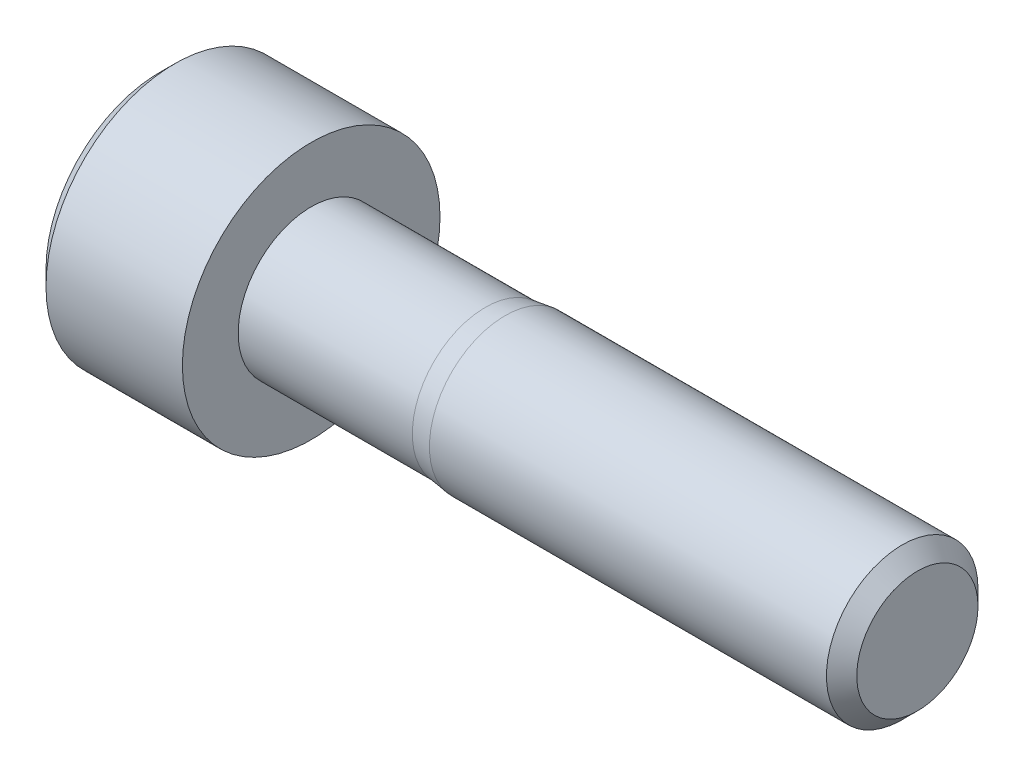
ISO-10303-21;
HEADER;
FILE_DESCRIPTION(('STEP AP214'),'2;1');
FILE_NAME('part.step','',(''),(''),'','','');
FILE_SCHEMA(('AUTOMOTIVE_DESIGN { 1 0 10303 214 1 1 1 1 }'));
ENDSEC;
DATA;
#1=APPLICATION_CONTEXT('core data for automotive mechanical design processes');
#2=APPLICATION_PROTOCOL_DEFINITION('international standard','automotive_design',2000,#1);
#3=PRODUCT_CONTEXT('',#1,'mechanical');
#4=PRODUCT('Part','Part','',(#3));
#5=PRODUCT_RELATED_PRODUCT_CATEGORY('part','',(#4));
#6=PRODUCT_DEFINITION_FORMATION('','',#4);
#7=PRODUCT_DEFINITION_CONTEXT('part definition',#1,'design');
#8=PRODUCT_DEFINITION('design','',#6,#7);
#9=PRODUCT_DEFINITION_SHAPE('','',#8);
#10=(LENGTH_UNIT() NAMED_UNIT(*) SI_UNIT(.MILLI.,.METRE.));
#11=(NAMED_UNIT(*) PLANE_ANGLE_UNIT() SI_UNIT($,.RADIAN.));
#12=(NAMED_UNIT(*) SI_UNIT($,.STERADIAN.) SOLID_ANGLE_UNIT());
#13=UNCERTAINTY_MEASURE_WITH_UNIT(LENGTH_MEASURE(1.E-05),#10,'distance_accuracy_value','');
#14=(GEOMETRIC_REPRESENTATION_CONTEXT(3) GLOBAL_UNCERTAINTY_ASSIGNED_CONTEXT((#13)) GLOBAL_UNIT_ASSIGNED_CONTEXT((#10,
#11,#12)) REPRESENTATION_CONTEXT('',''));
#15=CARTESIAN_POINT('',(0.,0.,0.));
#16=DIRECTION('',(0.,0.,1.));
#17=DIRECTION('',(1.,0.,0.));
#18=AXIS2_PLACEMENT_3D('',#15,#16,#17);
#19=CARTESIAN_POINT('',(-2.5,0.,0.));
#20=DIRECTION('',(-1.,0.,0.));
#21=DIRECTION('',(0.,0.,1.));
#22=AXIS2_PLACEMENT_3D('',#19,#20,#21);
#23=PLANE('',#22);
#24=DIRECTION('',(0.,-1.,0.));
#25=VECTOR('',#24,1.);
#26=CARTESIAN_POINT('',(-2.5,1.1547005383793,-2.));
#27=LINE('',#26,#25);
#28=CARTESIAN_POINT('',(-2.5,1.1547005383793,-2.));
#29=VERTEX_POINT('',#28);
#30=CARTESIAN_POINT('',(-2.5000000000068,0.,-2.));
#31=VERTEX_POINT('',#30);
#32=EDGE_CURVE('E484',#29,#31,#27,.T.);
#33=ORIENTED_EDGE('',*,*,#32,.T.);
#34=CARTESIAN_POINT('',(-2.5000000000068,0.,0.));
#35=DIRECTION('',(1.,0.,0.));
#36=DIRECTION('',(0.,0.,-1.));
#37=AXIS2_PLACEMENT_3D('',#34,#35,#36);
#38=CIRCLE('',#37,1.99999999999607);
#39=CARTESIAN_POINT('',(-2.5000000000068,1.7320508075655,-0.999999999998002));
#40=VERTEX_POINT('',#39);
#41=EDGE_CURVE('E75',#31,#40,#38,.T.);
#42=ORIENTED_EDGE('',*,*,#41,.T.);
#43=DIRECTION('',(0.,-0.499999999999983,-0.866025403784448));
#44=VECTOR('',#43,1.);
#45=CARTESIAN_POINT('',(-2.5,2.3094010767585,0.));
#46=LINE('',#45,#44);
#47=EDGE_CURVE('E402',#40,#29,#46,.T.);
#48=ORIENTED_EDGE('',*,*,#47,.T.);
#49=EDGE_LOOP('',(#33,#42,#48));
#50=FACE_BOUND('',#49,.T.);
#51=ADVANCED_FACE('F56',(#50),#23,.T.);
#52=CARTESIAN_POINT('',(-2.5,2.3094010767585,0.));
#53=VERTEX_POINT('',#52);
#54=EDGE_CURVE('E408',#53,#40,#46,.T.);
#55=ORIENTED_EDGE('',*,*,#54,.T.);
#56=CARTESIAN_POINT('',(-2.5000000000068,1.7320508075655,0.999999999998002));
#57=VERTEX_POINT('',#56);
#58=EDGE_CURVE('E252',#40,#57,#38,.T.);
#59=ORIENTED_EDGE('',*,*,#58,.T.);
#60=DIRECTION('',(0.,0.499999999999983,-0.866025403784448));
#61=VECTOR('',#60,1.);
#62=CARTESIAN_POINT('',(-2.5,1.1547005383793,2.));
#63=LINE('',#62,#61);
#64=EDGE_CURVE('E403',#57,#53,#63,.T.);
#65=ORIENTED_EDGE('',*,*,#64,.T.);
#66=EDGE_LOOP('',(#55,#59,#65));
#67=FACE_BOUND('',#66,.T.);
#68=ADVANCED_FACE('F164',(#67),#23,.T.);
#69=CARTESIAN_POINT('',(-2.5,1.1547005383793,2.));
#70=VERTEX_POINT('',#69);
#71=EDGE_CURVE('E395',#70,#57,#63,.T.);
#72=ORIENTED_EDGE('',*,*,#71,.T.);
#73=CARTESIAN_POINT('',(-2.5000000000068,0.,1.99999999999607));
#74=VERTEX_POINT('',#73);
#75=EDGE_CURVE('E396',#57,#74,#38,.T.);
#76=ORIENTED_EDGE('',*,*,#75,.T.);
#77=DIRECTION('',(0.,1.,0.));
#78=VECTOR('',#77,1.);
#79=CARTESIAN_POINT('',(-2.5,-1.1547005383793,2.));
#80=LINE('',#79,#78);
#81=EDGE_CURVE('E398',#74,#70,#80,.T.);
#82=ORIENTED_EDGE('',*,*,#81,.T.);
#83=EDGE_LOOP('',(#72,#76,#82));
#84=FACE_BOUND('',#83,.T.);
#85=ADVANCED_FACE('F169',(#84),#23,.T.);
#86=CARTESIAN_POINT('',(-2.5,-1.1547005383793,2.));
#87=VERTEX_POINT('',#86);
#88=EDGE_CURVE('E410',#87,#74,#80,.T.);
#89=ORIENTED_EDGE('',*,*,#88,.T.);
#90=CARTESIAN_POINT('',(-2.5000000000068,-1.73205080756549,0.999999999998002));
#91=VERTEX_POINT('',#90);
#92=EDGE_CURVE('E470',#74,#91,#38,.T.);
#93=ORIENTED_EDGE('',*,*,#92,.T.);
#94=DIRECTION('',(0.,0.499999999999983,0.866025403784448));
#95=VECTOR('',#94,1.);
#96=CARTESIAN_POINT('',(-2.5,-2.3094010767585,0.));
#97=LINE('',#96,#95);
#98=EDGE_CURVE('E464',#91,#87,#97,.T.);
#99=ORIENTED_EDGE('',*,*,#98,.T.);
#100=EDGE_LOOP('',(#89,#93,#99));
#101=FACE_BOUND('',#100,.T.);
#102=ADVANCED_FACE('F225',(#101),#23,.T.);
#103=CARTESIAN_POINT('',(-2.5,-2.3094010767585,0.));
#104=VERTEX_POINT('',#103);
#105=EDGE_CURVE('E465',#104,#91,#97,.T.);
#106=ORIENTED_EDGE('',*,*,#105,.T.);
#107=CARTESIAN_POINT('',(-2.5000000000068,-1.73205080756549,-0.999999999998002));
#108=VERTEX_POINT('',#107);
#109=EDGE_CURVE('E472',#91,#108,#38,.T.);
#110=ORIENTED_EDGE('',*,*,#109,.T.);
#111=DIRECTION('',(0.,-0.499999999999983,0.866025403784448));
#112=VECTOR('',#111,1.);
#113=CARTESIAN_POINT('',(-2.5,-1.1547005383793,-2.));
#114=LINE('',#113,#112);
#115=EDGE_CURVE('E483',#108,#104,#114,.T.);
#116=ORIENTED_EDGE('',*,*,#115,.T.);
#117=EDGE_LOOP('',(#106,#110,#116));
#118=FACE_BOUND('',#117,.T.);
#119=ADVANCED_FACE('F162',(#118),#23,.T.);
#120=CARTESIAN_POINT('',(0.,0.,0.));
#121=DIRECTION('',(-1.,0.,0.));
#122=DIRECTION('',(0.,0.,1.));
#123=AXIS2_PLACEMENT_3D('',#120,#121,#122);
#124=CYLINDRICAL_SURFACE('',#123,4.25);
#125=CARTESIAN_POINT('',(-4.49999999999871,0.,0.));
#126=DIRECTION('',(-1.,0.,0.));
#127=DIRECTION('',(0.,0.,1.));
#128=AXIS2_PLACEMENT_3D('',#125,#126,#127);
#129=CIRCLE('',#128,4.25);
#130=CARTESIAN_POINT('',(-4.49999999999871,0.,4.25));
#131=VERTEX_POINT('',#130);
#132=EDGE_CURVE('E13',#131,#131,#129,.F.);
#133=ORIENTED_EDGE('',*,*,#132,.T.);
#134=EDGE_LOOP('',(#133));
#135=FACE_BOUND('',#134,.T.);
#136=CARTESIAN_POINT('',(0.,0.,0.));
#137=DIRECTION('',(-1.,0.,0.));
#138=DIRECTION('',(0.,0.,1.));
#139=AXIS2_PLACEMENT_3D('',#136,#137,#138);
#140=CIRCLE('',#139,4.25);
#141=CARTESIAN_POINT('',(0.,0.,4.25));
#142=VERTEX_POINT('',#141);
#143=EDGE_CURVE('E231',#142,#142,#140,.T.);
#144=ORIENTED_EDGE('',*,*,#143,.T.);
#145=EDGE_LOOP('',(#144));
#146=FACE_BOUND('',#145,.T.);
#147=ADVANCED_FACE('F218',(#135,#146),#124,.T.);
#148=CARTESIAN_POINT('',(0.,4.25,0.));
#149=DIRECTION('',(1.,0.,0.));
#150=DIRECTION('',(0.,0.,-1.));
#151=AXIS2_PLACEMENT_3D('',#148,#149,#150);
#152=PLANE('',#151);
#153=CARTESIAN_POINT('',(0.,0.,0.));
#154=DIRECTION('',(1.,0.,0.));
#155=DIRECTION('',(0.,0.,-1.));
#156=AXIS2_PLACEMENT_3D('',#153,#154,#155);
#157=CIRCLE('',#156,2.41);
#158=CARTESIAN_POINT('',(0.,0.,-2.41));
#159=VERTEX_POINT('',#158);
#160=EDGE_CURVE('E234',#159,#159,#157,.T.);
#161=ORIENTED_EDGE('',*,*,#160,.F.);
#162=EDGE_LOOP('',(#161));
#163=FACE_BOUND('',#162,.T.);
#164=ORIENTED_EDGE('',*,*,#143,.F.);
#165=EDGE_LOOP('',(#164));
#166=FACE_BOUND('',#165,.T.);
#167=ADVANCED_FACE('F214',(#163,#166),#152,.T.);
#168=CARTESIAN_POINT('',(-5.,0.,0.));
#169=DIRECTION('',(-1.,0.,0.));
#170=DIRECTION('',(0.,0.,1.));
#171=AXIS2_PLACEMENT_3D('',#168,#169,#170);
#172=PLANE('',#171);
#173=CARTESIAN_POINT('',(-5.,0.,0.));
#174=DIRECTION('',(-1.,0.,0.));
#175=DIRECTION('',(0.,0.,1.));
#176=AXIS2_PLACEMENT_3D('',#173,#174,#175);
#177=CIRCLE('',#176,3.75000000000127);
#178=CARTESIAN_POINT('',(-5.,0.,3.75000000000127));
#179=VERTEX_POINT('',#178);
#180=EDGE_CURVE('E65',#179,#179,#177,.T.);
#181=ORIENTED_EDGE('',*,*,#180,.T.);
#182=EDGE_LOOP('',(#181));
#183=FACE_BOUND('',#182,.T.);
#184=DIRECTION('',(0.,-1.,0.));
#185=VECTOR('',#184,1.);
#186=CARTESIAN_POINT('',(-5.,1.1547005383793,-2.));
#187=LINE('',#186,#185);
#188=CARTESIAN_POINT('',(-5.,1.1547005383793,-2.));
#189=VERTEX_POINT('',#188);
#190=CARTESIAN_POINT('',(-5.,-1.1547005383793,-2.));
#191=VERTEX_POINT('',#190);
#192=EDGE_CURVE('E85',#189,#191,#187,.T.);
#193=ORIENTED_EDGE('',*,*,#192,.F.);
#194=DIRECTION('',(0.,-0.499999999999983,-0.866025403784448));
#195=VECTOR('',#194,1.);
#196=CARTESIAN_POINT('',(-5.,2.3094010767585,0.));
#197=LINE('',#196,#195);
#198=CARTESIAN_POINT('',(-5.,2.3094010767585,0.));
#199=VERTEX_POINT('',#198);
#200=EDGE_CURVE('E433',#199,#189,#197,.T.);
#201=ORIENTED_EDGE('',*,*,#200,.F.);
#202=DIRECTION('',(0.,0.499999999999983,-0.866025403784448));
#203=VECTOR('',#202,1.);
#204=CARTESIAN_POINT('',(-5.,1.1547005383793,2.));
#205=LINE('',#204,#203);
#206=CARTESIAN_POINT('',(-5.,1.1547005383793,2.));
#207=VERTEX_POINT('',#206);
#208=EDGE_CURVE('E429',#207,#199,#205,.T.);
#209=ORIENTED_EDGE('',*,*,#208,.F.);
#210=DIRECTION('',(0.,1.,0.));
#211=VECTOR('',#210,1.);
#212=CARTESIAN_POINT('',(-5.,-1.1547005383793,2.));
#213=LINE('',#212,#211);
#214=CARTESIAN_POINT('',(-5.,-1.1547005383793,2.));
#215=VERTEX_POINT('',#214);
#216=EDGE_CURVE('E426',#215,#207,#213,.T.);
#217=ORIENTED_EDGE('',*,*,#216,.F.);
#218=DIRECTION('',(0.,0.499999999999983,0.866025403784448));
#219=VECTOR('',#218,1.);
#220=CARTESIAN_POINT('',(-5.,-2.3094010767585,0.));
#221=LINE('',#220,#219);
#222=CARTESIAN_POINT('',(-5.,-2.3094010767585,0.));
#223=VERTEX_POINT('',#222);
#224=EDGE_CURVE('E422',#223,#215,#221,.T.);
#225=ORIENTED_EDGE('',*,*,#224,.F.);
#226=DIRECTION('',(0.,-0.499999999999983,0.866025403784448));
#227=VECTOR('',#226,1.);
#228=CARTESIAN_POINT('',(-5.,-1.1547005383793,-2.));
#229=LINE('',#228,#227);
#230=EDGE_CURVE('E418',#191,#223,#229,.T.);
#231=ORIENTED_EDGE('',*,*,#230,.F.);
#232=EDGE_LOOP('',(#193,#201,#209,#217,#225,#231));
#233=FACE_BOUND('',#232,.T.);
#234=ADVANCED_FACE('F210',(#183,#233),#172,.T.);
#235=CARTESIAN_POINT('',(5.7467889908257,0.,0.));
#236=DIRECTION('',(-1.,0.,0.));
#237=DIRECTION('',(0.,0.,1.));
#238=AXIS2_PLACEMENT_3D('',#235,#236,#237);
#239=CYLINDRICAL_SURFACE('',#238,2.41);
#240=CARTESIAN_POINT('',(5.7467889908257,0.,0.));
#241=DIRECTION('',(1.,0.,0.));
#242=DIRECTION('',(0.,0.,-1.));
#243=AXIS2_PLACEMENT_3D('',#240,#241,#242);
#244=CIRCLE('',#243,2.41);
#245=CARTESIAN_POINT('',(5.7467889908257,0.,-2.41));
#246=VERTEX_POINT('',#245);
#247=EDGE_CURVE('E235',#246,#246,#244,.T.);
#248=ORIENTED_EDGE('',*,*,#247,.F.);
#249=EDGE_LOOP('',(#248));
#250=FACE_BOUND('',#249,.T.);
#251=ORIENTED_EDGE('',*,*,#160,.T.);
#252=EDGE_LOOP('',(#251));
#253=FACE_BOUND('',#252,.T.);
#254=ADVANCED_FACE('F206',(#250,#253),#239,.T.);
#255=CARTESIAN_POINT('',(5.7467889908257,0.,0.));
#256=DIRECTION('',(1.,0.,0.));
#257=DIRECTION('',(0.,0.,-1.));
#258=AXIS2_PLACEMENT_3D('',#255,#256,#257);
#259=CONICAL_SURFACE('',#258,2.41,0.136918838700004);
#260=CARTESIAN_POINT('',(6.4,0.,0.));
#261=DIRECTION('',(1.,0.,0.));
#262=DIRECTION('',(0.,0.,-1.));
#263=AXIS2_PLACEMENT_3D('',#260,#261,#262);
#264=CIRCLE('',#263,2.49999999999383);
#265=CARTESIAN_POINT('',(6.4,0.,-2.49999999999383));
#266=VERTEX_POINT('',#265);
#267=EDGE_CURVE('E244',#266,#266,#264,.T.);
#268=ORIENTED_EDGE('',*,*,#267,.F.);
#269=EDGE_LOOP('',(#268));
#270=FACE_BOUND('',#269,.T.);
#271=ORIENTED_EDGE('',*,*,#247,.T.);
#272=EDGE_LOOP('',(#271));
#273=FACE_BOUND('',#272,.T.);
#274=ADVANCED_FACE('F202',(#270,#273),#259,.T.);
#275=CARTESIAN_POINT('',(20.,0.,0.));
#276=DIRECTION('',(-1.,0.,0.));
#277=DIRECTION('',(0.,0.,1.));
#278=AXIS2_PLACEMENT_3D('',#275,#276,#277);
#279=CYLINDRICAL_SURFACE('',#278,2.5);
#280=CARTESIAN_POINT('',(19.4999999999987,0.,0.));
#281=DIRECTION('',(1.,0.,0.));
#282=DIRECTION('',(0.,0.,-1.));
#283=AXIS2_PLACEMENT_3D('',#280,#281,#282);
#284=CIRCLE('',#283,2.5);
#285=CARTESIAN_POINT('',(19.4999999999987,0.,-2.5));
#286=VERTEX_POINT('',#285);
#287=EDGE_CURVE('E251',#286,#286,#284,.F.);
#288=ORIENTED_EDGE('',*,*,#287,.T.);
#289=EDGE_LOOP('',(#288));
#290=FACE_BOUND('',#289,.T.);
#291=ORIENTED_EDGE('',*,*,#267,.T.);
#292=EDGE_LOOP('',(#291));
#293=FACE_BOUND('',#292,.T.);
#294=ADVANCED_FACE('F198',(#290,#293),#279,.T.);
#295=CARTESIAN_POINT('',(20.,0.,0.));
#296=DIRECTION('',(1.,0.,0.));
#297=DIRECTION('',(0.,0.,-1.));
#298=AXIS2_PLACEMENT_3D('',#295,#296,#297);
#299=PLANE('',#298);
#300=CARTESIAN_POINT('',(20.,0.,0.));
#301=DIRECTION('',(1.,0.,0.));
#302=DIRECTION('',(0.,0.,-1.));
#303=AXIS2_PLACEMENT_3D('',#300,#301,#302);
#304=CIRCLE('',#303,2.00000000000128);
#305=CARTESIAN_POINT('',(20.,0.,-2.00000000000128));
#306=VERTEX_POINT('',#305);
#307=EDGE_CURVE('E247',#306,#306,#304,.T.);
#308=ORIENTED_EDGE('',*,*,#307,.T.);
#309=EDGE_LOOP('',(#308));
#310=FACE_BOUND('',#309,.T.);
#311=ADVANCED_FACE('F195',(#310),#299,.T.);
#312=CARTESIAN_POINT('',(-2.5,1.1547005383793,-2.));
#313=DIRECTION('',(0.,0.,-1.));
#314=DIRECTION('',(-1.,0.,0.));
#315=AXIS2_PLACEMENT_3D('',#312,#313,#314);
#316=PLANE('',#315);
#317=ORIENTED_EDGE('',*,*,#192,.T.);
#318=DIRECTION('',(-1.,0.,0.));
#319=VECTOR('',#318,1.);
#320=CARTESIAN_POINT('',(-2.5,-1.1547005383793,-2.));
#321=LINE('',#320,#319);
#322=CARTESIAN_POINT('',(-2.5,-1.1547005383793,-2.));
#323=VERTEX_POINT('',#322);
#324=EDGE_CURVE('E416',#323,#191,#321,.T.);
#325=ORIENTED_EDGE('',*,*,#324,.F.);
#326=EDGE_CURVE('E437',#31,#323,#27,.T.);
#327=ORIENTED_EDGE('',*,*,#326,.F.);
#328=ORIENTED_EDGE('',*,*,#32,.F.);
#329=DIRECTION('',(-1.,0.,0.));
#330=VECTOR('',#329,1.);
#331=CARTESIAN_POINT('',(-2.5,1.1547005383793,-2.));
#332=LINE('',#331,#330);
#333=EDGE_CURVE('E438',#29,#189,#332,.T.);
#334=ORIENTED_EDGE('',*,*,#333,.T.);
#335=EDGE_LOOP('',(#317,#325,#327,#328,#334));
#336=FACE_BOUND('',#335,.T.);
#337=ADVANCED_FACE('F177',(#336),#316,.F.);
#338=CARTESIAN_POINT('',(-2.5,2.3094010767585,0.));
#339=DIRECTION('',(0.,0.866025403784448,-0.499999999999983));
#340=DIRECTION('',(0.,0.499999999999983,0.866025403784448));
#341=AXIS2_PLACEMENT_3D('',#338,#339,#340);
#342=PLANE('',#341);
#343=ORIENTED_EDGE('',*,*,#200,.T.);
#344=ORIENTED_EDGE('',*,*,#333,.F.);
#345=ORIENTED_EDGE('',*,*,#47,.F.);
#346=ORIENTED_EDGE('',*,*,#54,.F.);
#347=DIRECTION('',(-1.,0.,0.));
#348=VECTOR('',#347,1.);
#349=CARTESIAN_POINT('',(-2.5,2.3094010767585,0.));
#350=LINE('',#349,#348);
#351=EDGE_CURVE('E441',#53,#199,#350,.T.);
#352=ORIENTED_EDGE('',*,*,#351,.T.);
#353=EDGE_LOOP('',(#343,#344,#345,#346,#352));
#354=FACE_BOUND('',#353,.T.);
#355=ADVANCED_FACE('F173',(#354),#342,.F.);
#356=CARTESIAN_POINT('',(-2.5,1.1547005383793,2.));
#357=DIRECTION('',(0.,0.866025403784448,0.499999999999983));
#358=DIRECTION('',(0.,-0.499999999999983,0.866025403784448));
#359=AXIS2_PLACEMENT_3D('',#356,#357,#358);
#360=PLANE('',#359);
#361=ORIENTED_EDGE('',*,*,#208,.T.);
#362=ORIENTED_EDGE('',*,*,#351,.F.);
#363=ORIENTED_EDGE('',*,*,#64,.F.);
#364=ORIENTED_EDGE('',*,*,#71,.F.);
#365=DIRECTION('',(-1.,0.,0.));
#366=VECTOR('',#365,1.);
#367=CARTESIAN_POINT('',(-2.5,1.1547005383793,2.));
#368=LINE('',#367,#366);
#369=EDGE_CURVE('E444',#70,#207,#368,.T.);
#370=ORIENTED_EDGE('',*,*,#369,.T.);
#371=EDGE_LOOP('',(#361,#362,#363,#364,#370));
#372=FACE_BOUND('',#371,.T.);
#373=ADVANCED_FACE('F176',(#372),#360,.F.);
#374=CARTESIAN_POINT('',(-2.5,-1.1547005383793,2.));
#375=DIRECTION('',(0.,0.,1.));
#376=DIRECTION('',(1.,0.,0.));
#377=AXIS2_PLACEMENT_3D('',#374,#375,#376);
#378=PLANE('',#377);
#379=ORIENTED_EDGE('',*,*,#216,.T.);
#380=ORIENTED_EDGE('',*,*,#369,.F.);
#381=ORIENTED_EDGE('',*,*,#81,.F.);
#382=ORIENTED_EDGE('',*,*,#88,.F.);
#383=DIRECTION('',(-1.,0.,0.));
#384=VECTOR('',#383,1.);
#385=CARTESIAN_POINT('',(-2.5,-1.1547005383793,2.));
#386=LINE('',#385,#384);
#387=EDGE_CURVE('E447',#87,#215,#386,.T.);
#388=ORIENTED_EDGE('',*,*,#387,.T.);
#389=EDGE_LOOP('',(#379,#380,#381,#382,#388));
#390=FACE_BOUND('',#389,.T.);
#391=ADVANCED_FACE('F181',(#390),#378,.F.);
#392=CARTESIAN_POINT('',(-2.5,-2.3094010767585,0.));
#393=DIRECTION('',(0.,-0.866025403784448,0.499999999999983));
#394=DIRECTION('',(0.,-0.499999999999983,-0.866025403784448));
#395=AXIS2_PLACEMENT_3D('',#392,#393,#394);
#396=PLANE('',#395);
#397=ORIENTED_EDGE('',*,*,#224,.T.);
#398=ORIENTED_EDGE('',*,*,#387,.F.);
#399=ORIENTED_EDGE('',*,*,#98,.F.);
#400=ORIENTED_EDGE('',*,*,#105,.F.);
#401=DIRECTION('',(-1.,0.,0.));
#402=VECTOR('',#401,1.);
#403=CARTESIAN_POINT('',(-2.5,-2.3094010767585,0.));
#404=LINE('',#403,#402);
#405=EDGE_CURVE('E450',#104,#223,#404,.T.);
#406=ORIENTED_EDGE('',*,*,#405,.T.);
#407=EDGE_LOOP('',(#397,#398,#399,#400,#406));
#408=FACE_BOUND('',#407,.T.);
#409=ADVANCED_FACE('F185',(#408),#396,.F.);
#410=CARTESIAN_POINT('',(-2.5,-1.1547005383793,-2.));
#411=DIRECTION('',(0.,-0.866025403784448,-0.499999999999983));
#412=DIRECTION('',(0.,0.499999999999983,-0.866025403784448));
#413=AXIS2_PLACEMENT_3D('',#410,#411,#412);
#414=PLANE('',#413);
#415=ORIENTED_EDGE('',*,*,#230,.T.);
#416=ORIENTED_EDGE('',*,*,#405,.F.);
#417=ORIENTED_EDGE('',*,*,#115,.F.);
#418=EDGE_CURVE('E466',#323,#108,#114,.T.);
#419=ORIENTED_EDGE('',*,*,#418,.F.);
#420=ORIENTED_EDGE('',*,*,#324,.T.);
#421=EDGE_LOOP('',(#415,#416,#417,#419,#420));
#422=FACE_BOUND('',#421,.T.);
#423=ADVANCED_FACE('F159',(#422),#414,.F.);
#424=ORIENTED_EDGE('',*,*,#418,.T.);
#425=EDGE_CURVE('E240',#108,#31,#38,.T.);
#426=ORIENTED_EDGE('',*,*,#425,.T.);
#427=ORIENTED_EDGE('',*,*,#326,.T.);
#428=EDGE_LOOP('',(#424,#426,#427));
#429=FACE_BOUND('',#428,.T.);
#430=ADVANCED_FACE('F152',(#429),#23,.T.);
#431=CARTESIAN_POINT('',(-1.34529946162982,0.,0.));
#432=DIRECTION('',(-1.,0.,0.));
#433=DIRECTION('',(0.,0.,1.));
#434=AXIS2_PLACEMENT_3D('',#431,#432,#433);
#435=CONICAL_SURFACE('',#434,0.,1.0471975511966);
#436=ORIENTED_EDGE('',*,*,#41,.F.);
#437=ORIENTED_EDGE('',*,*,#425,.F.);
#438=ORIENTED_EDGE('',*,*,#109,.F.);
#439=ORIENTED_EDGE('',*,*,#92,.F.);
#440=ORIENTED_EDGE('',*,*,#75,.F.);
#441=ORIENTED_EDGE('',*,*,#58,.F.);
#442=EDGE_LOOP('',(#436,#437,#438,#439,#440,#441));
#443=FACE_BOUND('',#442,.T.);
#444=CARTESIAN_POINT('',(-1.34529946162982,0.,0.));
#445=VERTEX_POINT('',#444);
#446=VERTEX_LOOP('',#445);
#447=FACE_BOUND('',#446,.T.);
#448=ADVANCED_FACE('F149',(#443,#447),#435,.F.);
#449=CARTESIAN_POINT('',(20.,0.,0.));
#450=DIRECTION('',(-1.,0.,0.));
#451=DIRECTION('',(0.,0.,1.));
#452=AXIS2_PLACEMENT_3D('',#449,#450,#451);
#453=CONICAL_SURFACE('',#452,2.00000000000128,0.785398163394889);
#454=ORIENTED_EDGE('',*,*,#287,.F.);
#455=EDGE_LOOP('',(#454));
#456=FACE_BOUND('',#455,.T.);
#457=ORIENTED_EDGE('',*,*,#307,.F.);
#458=EDGE_LOOP('',(#457));
#459=FACE_BOUND('',#458,.T.);
#460=ADVANCED_FACE('F151',(#456,#459),#453,.T.);
#461=CARTESIAN_POINT('',(-5.,0.,0.));
#462=DIRECTION('',(1.,0.,0.));
#463=DIRECTION('',(0.,0.,-1.));
#464=AXIS2_PLACEMENT_3D('',#461,#462,#463);
#465=CONICAL_SURFACE('',#464,3.75000000000127,0.78539816339489);
#466=ORIENTED_EDGE('',*,*,#132,.F.);
#467=EDGE_LOOP('',(#466));
#468=FACE_BOUND('',#467,.T.);
#469=ORIENTED_EDGE('',*,*,#180,.F.);
#470=EDGE_LOOP('',(#469));
#471=FACE_BOUND('',#470,.T.);
#472=ADVANCED_FACE('F58',(#468,#471),#465,.T.);
#473=CLOSED_SHELL('',(#51,#68,#85,#102,#119,#147,#167,#234,#254,#274,#294,#311,#337,#355,#373,
#391,#409,#423,#430,#448,#460,#472));
#474=MANIFOLD_SOLID_BREP('B2',#473);
#475=ADVANCED_BREP_SHAPE_REPRESENTATION('',(#18,#474),#14);
#476=SHAPE_DEFINITION_REPRESENTATION(#9,#475);
ENDSEC;
END-ISO-10303-21;
